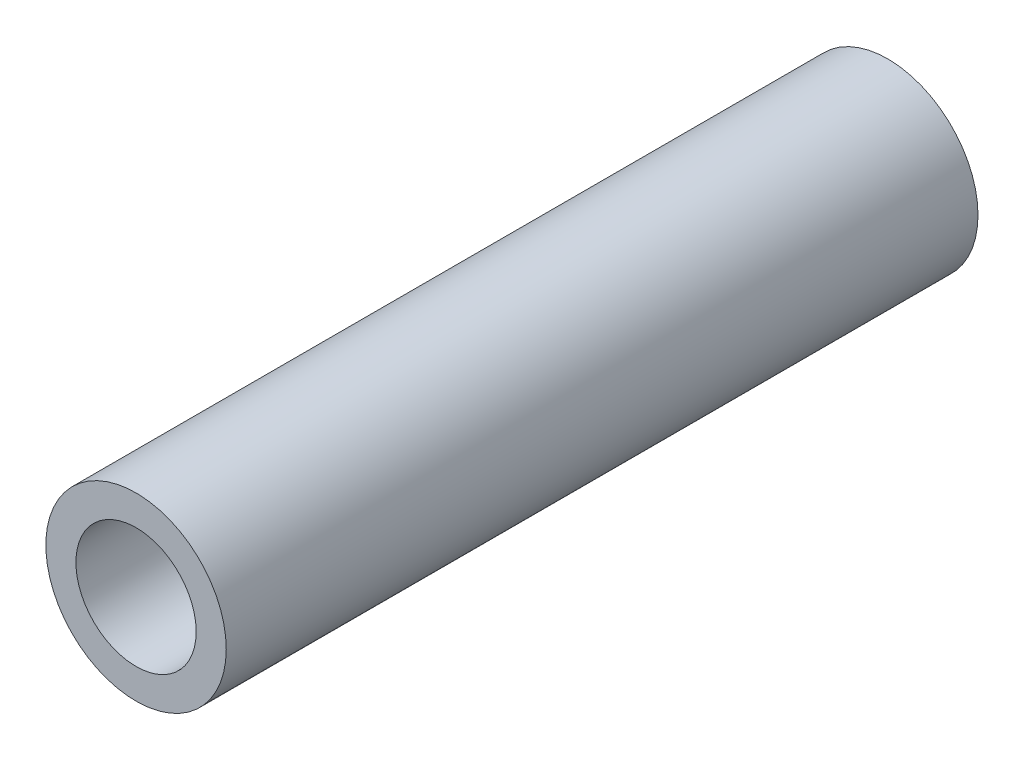
ISO-10303-21;
HEADER;
FILE_DESCRIPTION(('STEP AP214'),'2;1');
FILE_NAME('part.step','',(''),(''),'','','');
FILE_SCHEMA(('AUTOMOTIVE_DESIGN { 1 0 10303 214 1 1 1 1 }'));
ENDSEC;
DATA;
#1=APPLICATION_CONTEXT('core data for automotive mechanical design processes');
#2=APPLICATION_PROTOCOL_DEFINITION('international standard','automotive_design',2000,#1);
#3=PRODUCT_CONTEXT('',#1,'mechanical');
#4=PRODUCT('Part','Part','',(#3));
#5=PRODUCT_RELATED_PRODUCT_CATEGORY('part','',(#4));
#6=PRODUCT_DEFINITION_FORMATION('','',#4);
#7=PRODUCT_DEFINITION_CONTEXT('part definition',#1,'design');
#8=PRODUCT_DEFINITION('design','',#6,#7);
#9=PRODUCT_DEFINITION_SHAPE('','',#8);
#10=(LENGTH_UNIT() NAMED_UNIT(*) SI_UNIT(.MILLI.,.METRE.));
#11=(NAMED_UNIT(*) PLANE_ANGLE_UNIT() SI_UNIT($,.RADIAN.));
#12=(NAMED_UNIT(*) SI_UNIT($,.STERADIAN.) SOLID_ANGLE_UNIT());
#13=UNCERTAINTY_MEASURE_WITH_UNIT(LENGTH_MEASURE(1.E-05),#10,'distance_accuracy_value','');
#14=(GEOMETRIC_REPRESENTATION_CONTEXT(3) GLOBAL_UNCERTAINTY_ASSIGNED_CONTEXT((#13)) GLOBAL_UNIT_ASSIGNED_CONTEXT((#10,
#11,#12)) REPRESENTATION_CONTEXT('',''));
#15=CARTESIAN_POINT('',(0.,0.,0.));
#16=DIRECTION('',(0.,0.,1.));
#17=DIRECTION('',(1.,0.,0.));
#18=AXIS2_PLACEMENT_3D('',#15,#16,#17);
#19=CARTESIAN_POINT('',(0.,0.,12.5));
#20=DIRECTION('',(0.,0.,1.));
#21=DIRECTION('',(1.,0.,0.));
#22=AXIS2_PLACEMENT_3D('',#19,#20,#21);
#23=PLANE('',#22);
#24=CARTESIAN_POINT('',(0.,0.,12.5));
#25=DIRECTION('',(0.,0.,1.));
#26=DIRECTION('',(1.,0.,0.));
#27=AXIS2_PLACEMENT_3D('',#24,#25,#26);
#28=CIRCLE('',#27,3.);
#29=CARTESIAN_POINT('',(3.,0.,12.5));
#30=VERTEX_POINT('',#29);
#31=EDGE_CURVE('E10',#30,#30,#28,.T.);
#32=ORIENTED_EDGE('',*,*,#31,.T.);
#33=EDGE_LOOP('',(#32));
#34=FACE_BOUND('',#33,.T.);
#35=CARTESIAN_POINT('',(0.,0.,12.5));
#36=DIRECTION('',(0.,0.,1.));
#37=DIRECTION('',(1.,0.,0.));
#38=AXIS2_PLACEMENT_3D('',#35,#36,#37);
#39=CIRCLE('',#38,2.);
#40=CARTESIAN_POINT('',(2.,0.,12.5));
#41=VERTEX_POINT('',#40);
#42=EDGE_CURVE('E42',#41,#41,#39,.T.);
#43=ORIENTED_EDGE('',*,*,#42,.F.);
#44=EDGE_LOOP('',(#43));
#45=FACE_BOUND('',#44,.T.);
#46=ADVANCED_FACE('F31',(#34,#45),#23,.T.);
#47=CARTESIAN_POINT('',(0.,0.,-12.5));
#48=DIRECTION('',(0.,0.,1.));
#49=DIRECTION('',(1.,0.,0.));
#50=AXIS2_PLACEMENT_3D('',#47,#48,#49);
#51=PLANE('',#50);
#52=CARTESIAN_POINT('',(0.,0.,-12.5));
#53=DIRECTION('',(0.,0.,1.));
#54=DIRECTION('',(1.,0.,0.));
#55=AXIS2_PLACEMENT_3D('',#52,#53,#54);
#56=CIRCLE('',#55,3.);
#57=CARTESIAN_POINT('',(3.,0.,-12.5));
#58=VERTEX_POINT('',#57);
#59=EDGE_CURVE('E35',#58,#58,#56,.T.);
#60=ORIENTED_EDGE('',*,*,#59,.F.);
#61=EDGE_LOOP('',(#60));
#62=FACE_BOUND('',#61,.T.);
#63=CARTESIAN_POINT('',(0.,0.,-12.5));
#64=DIRECTION('',(0.,0.,1.));
#65=DIRECTION('',(1.,0.,0.));
#66=AXIS2_PLACEMENT_3D('',#63,#64,#65);
#67=CIRCLE('',#66,2.);
#68=CARTESIAN_POINT('',(2.,0.,-12.5));
#69=VERTEX_POINT('',#68);
#70=EDGE_CURVE('E44',#69,#69,#67,.T.);
#71=ORIENTED_EDGE('',*,*,#70,.T.);
#72=EDGE_LOOP('',(#71));
#73=FACE_BOUND('',#72,.T.);
#74=ADVANCED_FACE('F54',(#62,#73),#51,.F.);
#75=CARTESIAN_POINT('',(0.,0.,12.5));
#76=DIRECTION('',(0.,0.,-1.));
#77=DIRECTION('',(-1.,0.,0.));
#78=AXIS2_PLACEMENT_3D('',#75,#76,#77);
#79=CYLINDRICAL_SURFACE('',#78,3.);
#80=ORIENTED_EDGE('',*,*,#31,.F.);
#81=EDGE_LOOP('',(#80));
#82=FACE_BOUND('',#81,.T.);
#83=ORIENTED_EDGE('',*,*,#59,.T.);
#84=EDGE_LOOP('',(#83));
#85=FACE_BOUND('',#84,.T.);
#86=ADVANCED_FACE('F33',(#82,#85),#79,.T.);
#87=CARTESIAN_POINT('',(0.,0.,12.5));
#88=DIRECTION('',(0.,0.,-1.));
#89=DIRECTION('',(-1.,0.,0.));
#90=AXIS2_PLACEMENT_3D('',#87,#88,#89);
#91=CYLINDRICAL_SURFACE('',#90,2.);
#92=ORIENTED_EDGE('',*,*,#42,.T.);
#93=EDGE_LOOP('',(#92));
#94=FACE_BOUND('',#93,.T.);
#95=ORIENTED_EDGE('',*,*,#70,.F.);
#96=EDGE_LOOP('',(#95));
#97=FACE_BOUND('',#96,.T.);
#98=ADVANCED_FACE('F50',(#94,#97),#91,.F.);
#99=CLOSED_SHELL('',(#46,#74,#86,#98));
#100=MANIFOLD_SOLID_BREP('B2',#99);
#101=ADVANCED_BREP_SHAPE_REPRESENTATION('',(#18,#100),#14);
#102=SHAPE_DEFINITION_REPRESENTATION(#9,#101);
ENDSEC;
END-ISO-10303-21;
